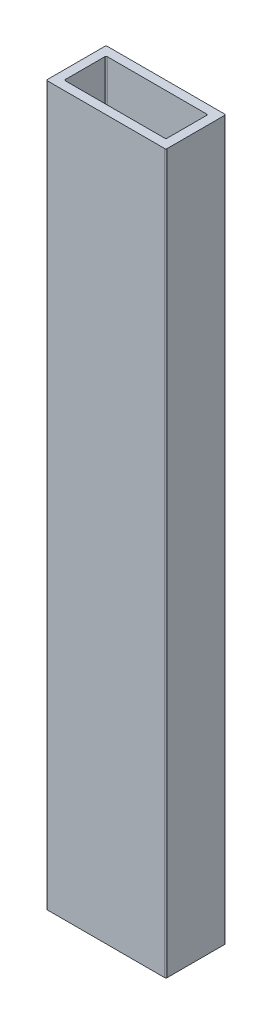
ISO-10303-21;
HEADER;
FILE_DESCRIPTION(('STEP AP214'),'2;1');
FILE_NAME('part.step','',(''),(''),'','','');
FILE_SCHEMA(('AUTOMOTIVE_DESIGN { 1 0 10303 214 1 1 1 1 }'));
ENDSEC;
DATA;
#1=APPLICATION_CONTEXT('core data for automotive mechanical design processes');
#2=APPLICATION_PROTOCOL_DEFINITION('international standard','automotive_design',2000,#1);
#3=PRODUCT_CONTEXT('',#1,'mechanical');
#4=PRODUCT('Part','Part','',(#3));
#5=PRODUCT_RELATED_PRODUCT_CATEGORY('part','',(#4));
#6=PRODUCT_DEFINITION_FORMATION('','',#4);
#7=PRODUCT_DEFINITION_CONTEXT('part definition',#1,'design');
#8=PRODUCT_DEFINITION('design','',#6,#7);
#9=PRODUCT_DEFINITION_SHAPE('','',#8);
#10=(LENGTH_UNIT() NAMED_UNIT(*) SI_UNIT(.MILLI.,.METRE.));
#11=(NAMED_UNIT(*) PLANE_ANGLE_UNIT() SI_UNIT($,.RADIAN.));
#12=(NAMED_UNIT(*) SI_UNIT($,.STERADIAN.) SOLID_ANGLE_UNIT());
#13=UNCERTAINTY_MEASURE_WITH_UNIT(LENGTH_MEASURE(1.E-05),#10,'distance_accuracy_value','');
#14=(GEOMETRIC_REPRESENTATION_CONTEXT(3) GLOBAL_UNCERTAINTY_ASSIGNED_CONTEXT((#13)) GLOBAL_UNIT_ASSIGNED_CONTEXT((#10,
#11,#12)) REPRESENTATION_CONTEXT('',''));
#15=CARTESIAN_POINT('',(0.,0.,0.));
#16=DIRECTION('',(0.,0.,1.));
#17=DIRECTION('',(1.,0.,0.));
#18=AXIS2_PLACEMENT_3D('',#15,#16,#17);
#19=CARTESIAN_POINT('',(0.,120.,0.));
#20=DIRECTION('',(0.,-1.,0.));
#21=DIRECTION('',(0.,0.,-1.));
#22=AXIS2_PLACEMENT_3D('',#19,#20,#21);
#23=PLANE('',#22);
#24=DIRECTION('',(0.,0.,-1.));
#25=VECTOR('',#24,1.);
#26=CARTESIAN_POINT('',(10.,120.,-5.));
#27=LINE('',#26,#25);
#28=CARTESIAN_POINT('',(10.,120.,4.8));
#29=VERTEX_POINT('',#28);
#30=CARTESIAN_POINT('',(10.,120.,-4.8));
#31=VERTEX_POINT('',#30);
#32=EDGE_CURVE('E278',#29,#31,#27,.T.);
#33=ORIENTED_EDGE('',*,*,#32,.T.);
#34=CARTESIAN_POINT('',(9.8,120.,-4.8));
#35=DIRECTION('',(0.,-1.,0.));
#36=DIRECTION('',(0.,0.,-1.));
#37=AXIS2_PLACEMENT_3D('',#34,#35,#36);
#38=CIRCLE('',#37,0.2);
#39=CARTESIAN_POINT('',(9.8,120.,-5.));
#40=VERTEX_POINT('',#39);
#41=EDGE_CURVE('E199',#31,#40,#38,.F.);
#42=ORIENTED_EDGE('',*,*,#41,.T.);
#43=DIRECTION('',(-1.,0.,0.));
#44=VECTOR('',#43,1.);
#45=CARTESIAN_POINT('',(10.,120.,-5.));
#46=LINE('',#45,#44);
#47=CARTESIAN_POINT('',(-9.8,120.,-5.));
#48=VERTEX_POINT('',#47);
#49=EDGE_CURVE('E168',#40,#48,#46,.T.);
#50=ORIENTED_EDGE('',*,*,#49,.T.);
#51=CARTESIAN_POINT('',(-9.8,120.,-4.8));
#52=DIRECTION('',(0.,-1.,0.));
#53=DIRECTION('',(0.,0.,-1.));
#54=AXIS2_PLACEMENT_3D('',#51,#52,#53);
#55=CIRCLE('',#54,0.2);
#56=CARTESIAN_POINT('',(-10.,120.,-4.8));
#57=VERTEX_POINT('',#56);
#58=EDGE_CURVE('E197',#48,#57,#55,.F.);
#59=ORIENTED_EDGE('',*,*,#58,.T.);
#60=DIRECTION('',(0.,0.,1.));
#61=VECTOR('',#60,1.);
#62=CARTESIAN_POINT('',(-10.,120.,-5.));
#63=LINE('',#62,#61);
#64=CARTESIAN_POINT('',(-10.,120.,4.8));
#65=VERTEX_POINT('',#64);
#66=EDGE_CURVE('E175',#57,#65,#63,.T.);
#67=ORIENTED_EDGE('',*,*,#66,.T.);
#68=CARTESIAN_POINT('',(-9.8,120.,4.8));
#69=DIRECTION('',(0.,-1.,0.));
#70=DIRECTION('',(0.,0.,-1.));
#71=AXIS2_PLACEMENT_3D('',#68,#69,#70);
#72=CIRCLE('',#71,0.2);
#73=CARTESIAN_POINT('',(-9.8,120.,5.));
#74=VERTEX_POINT('',#73);
#75=EDGE_CURVE('E193',#65,#74,#72,.F.);
#76=ORIENTED_EDGE('',*,*,#75,.T.);
#77=DIRECTION('',(1.,0.,0.));
#78=VECTOR('',#77,1.);
#79=CARTESIAN_POINT('',(10.,120.,5.));
#80=LINE('',#79,#78);
#81=CARTESIAN_POINT('',(9.8,120.,5.));
#82=VERTEX_POINT('',#81);
#83=EDGE_CURVE('E179',#74,#82,#80,.T.);
#84=ORIENTED_EDGE('',*,*,#83,.T.);
#85=CARTESIAN_POINT('',(9.8,120.,4.8));
#86=DIRECTION('',(0.,-1.,0.));
#87=DIRECTION('',(0.,0.,-1.));
#88=AXIS2_PLACEMENT_3D('',#85,#86,#87);
#89=CIRCLE('',#88,0.2);
#90=EDGE_CURVE('E195',#82,#29,#89,.F.);
#91=ORIENTED_EDGE('',*,*,#90,.T.);
#92=EDGE_LOOP('',(#33,#42,#50,#59,#67,#76,#84,#91));
#93=FACE_BOUND('',#92,.T.);
#94=DIRECTION('',(0.,0.,-1.));
#95=VECTOR('',#94,1.);
#96=CARTESIAN_POINT('',(8.5,120.,-3.5));
#97=LINE('',#96,#95);
#98=CARTESIAN_POINT('',(8.5,120.,3.3));
#99=VERTEX_POINT('',#98);
#100=CARTESIAN_POINT('',(8.5,120.,-3.3));
#101=VERTEX_POINT('',#100);
#102=EDGE_CURVE('E260',#99,#101,#97,.T.);
#103=ORIENTED_EDGE('',*,*,#102,.F.);
#104=CARTESIAN_POINT('',(8.3,120.,3.3));
#105=DIRECTION('',(0.,-1.,0.));
#106=DIRECTION('',(0.,0.,-1.));
#107=AXIS2_PLACEMENT_3D('',#104,#105,#106);
#108=CIRCLE('',#107,0.2);
#109=CARTESIAN_POINT('',(8.3,120.,3.5));
#110=VERTEX_POINT('',#109);
#111=EDGE_CURVE('E236',#99,#110,#108,.T.);
#112=ORIENTED_EDGE('',*,*,#111,.T.);
#113=DIRECTION('',(1.,0.,0.));
#114=VECTOR('',#113,1.);
#115=CARTESIAN_POINT('',(8.5,120.,3.5));
#116=LINE('',#115,#114);
#117=CARTESIAN_POINT('',(-8.3,120.,3.5));
#118=VERTEX_POINT('',#117);
#119=EDGE_CURVE('E262',#118,#110,#116,.T.);
#120=ORIENTED_EDGE('',*,*,#119,.F.);
#121=CARTESIAN_POINT('',(-8.3,120.,3.3));
#122=DIRECTION('',(0.,-1.,0.));
#123=DIRECTION('',(0.,0.,-1.));
#124=AXIS2_PLACEMENT_3D('',#121,#122,#123);
#125=CIRCLE('',#124,0.2);
#126=CARTESIAN_POINT('',(-8.5,120.,3.3));
#127=VERTEX_POINT('',#126);
#128=EDGE_CURVE('E240',#118,#127,#125,.T.);
#129=ORIENTED_EDGE('',*,*,#128,.T.);
#130=DIRECTION('',(0.,0.,1.));
#131=VECTOR('',#130,1.);
#132=CARTESIAN_POINT('',(-8.5,120.,-3.5));
#133=LINE('',#132,#131);
#134=CARTESIAN_POINT('',(-8.5,120.,-3.3));
#135=VERTEX_POINT('',#134);
#136=EDGE_CURVE('E259',#135,#127,#133,.T.);
#137=ORIENTED_EDGE('',*,*,#136,.F.);
#138=CARTESIAN_POINT('',(-8.3,120.,-3.3));
#139=DIRECTION('',(0.,-1.,0.));
#140=DIRECTION('',(0.,0.,-1.));
#141=AXIS2_PLACEMENT_3D('',#138,#139,#140);
#142=CIRCLE('',#141,0.2);
#143=CARTESIAN_POINT('',(-8.3,120.,-3.5));
#144=VERTEX_POINT('',#143);
#145=EDGE_CURVE('E11',#135,#144,#142,.T.);
#146=ORIENTED_EDGE('',*,*,#145,.T.);
#147=DIRECTION('',(-1.,0.,0.));
#148=VECTOR('',#147,1.);
#149=CARTESIAN_POINT('',(8.5,120.,-3.5));
#150=LINE('',#149,#148);
#151=CARTESIAN_POINT('',(8.3,120.,-3.5));
#152=VERTEX_POINT('',#151);
#153=EDGE_CURVE('E257',#152,#144,#150,.T.);
#154=ORIENTED_EDGE('',*,*,#153,.F.);
#155=CARTESIAN_POINT('',(8.3,120.,-3.3));
#156=DIRECTION('',(0.,-1.,0.));
#157=DIRECTION('',(0.,0.,-1.));
#158=AXIS2_PLACEMENT_3D('',#155,#156,#157);
#159=CIRCLE('',#158,0.2);
#160=EDGE_CURVE('E232',#152,#101,#159,.T.);
#161=ORIENTED_EDGE('',*,*,#160,.T.);
#162=EDGE_LOOP('',(#103,#112,#120,#129,#137,#146,#154,#161));
#163=FACE_BOUND('',#162,.T.);
#164=ADVANCED_FACE('F35',(#93,#163),#23,.F.);
#165=CARTESIAN_POINT('',(0.,0.,0.));
#166=DIRECTION('',(0.,-1.,0.));
#167=DIRECTION('',(0.,0.,-1.));
#168=AXIS2_PLACEMENT_3D('',#165,#166,#167);
#169=PLANE('',#168);
#170=DIRECTION('',(-1.,0.,0.));
#171=VECTOR('',#170,1.);
#172=CARTESIAN_POINT('',(10.,0.,-5.));
#173=LINE('',#172,#171);
#174=CARTESIAN_POINT('',(9.8,0.,-5.));
#175=VERTEX_POINT('',#174);
#176=CARTESIAN_POINT('',(-9.8,0.,-5.));
#177=VERTEX_POINT('',#176);
#178=EDGE_CURVE('E165',#175,#177,#173,.T.);
#179=ORIENTED_EDGE('',*,*,#178,.F.);
#180=CARTESIAN_POINT('',(9.8,0.,-4.8));
#181=DIRECTION('',(0.,-1.,0.));
#182=DIRECTION('',(0.,0.,-1.));
#183=AXIS2_PLACEMENT_3D('',#180,#181,#182);
#184=CIRCLE('',#183,0.2);
#185=CARTESIAN_POINT('',(10.,0.,-4.8));
#186=VERTEX_POINT('',#185);
#187=EDGE_CURVE('E148',#175,#186,#184,.T.);
#188=ORIENTED_EDGE('',*,*,#187,.T.);
#189=DIRECTION('',(0.,0.,-1.));
#190=VECTOR('',#189,1.);
#191=CARTESIAN_POINT('',(10.,0.,-5.));
#192=LINE('',#191,#190);
#193=CARTESIAN_POINT('',(10.,0.,4.8));
#194=VERTEX_POINT('',#193);
#195=EDGE_CURVE('E176',#194,#186,#192,.T.);
#196=ORIENTED_EDGE('',*,*,#195,.F.);
#197=CARTESIAN_POINT('',(9.8,0.,4.8));
#198=DIRECTION('',(0.,-1.,0.));
#199=DIRECTION('',(0.,0.,-1.));
#200=AXIS2_PLACEMENT_3D('',#197,#198,#199);
#201=CIRCLE('',#200,0.2);
#202=CARTESIAN_POINT('',(9.8,0.,5.));
#203=VERTEX_POINT('',#202);
#204=EDGE_CURVE('E187',#194,#203,#201,.T.);
#205=ORIENTED_EDGE('',*,*,#204,.T.);
#206=DIRECTION('',(1.,0.,0.));
#207=VECTOR('',#206,1.);
#208=CARTESIAN_POINT('',(10.,0.,5.));
#209=LINE('',#208,#207);
#210=CARTESIAN_POINT('',(-9.8,0.,5.));
#211=VERTEX_POINT('',#210);
#212=EDGE_CURVE('E181',#211,#203,#209,.T.);
#213=ORIENTED_EDGE('',*,*,#212,.F.);
#214=CARTESIAN_POINT('',(-9.8,0.,4.8));
#215=DIRECTION('',(0.,-1.,0.));
#216=DIRECTION('',(0.,0.,-1.));
#217=AXIS2_PLACEMENT_3D('',#214,#215,#216);
#218=CIRCLE('',#217,0.2);
#219=CARTESIAN_POINT('',(-10.,0.,4.8));
#220=VERTEX_POINT('',#219);
#221=EDGE_CURVE('E169',#211,#220,#218,.T.);
#222=ORIENTED_EDGE('',*,*,#221,.T.);
#223=DIRECTION('',(0.,0.,1.));
#224=VECTOR('',#223,1.);
#225=CARTESIAN_POINT('',(-10.,0.,-5.));
#226=LINE('',#225,#224);
#227=CARTESIAN_POINT('',(-10.,0.,-4.8));
#228=VERTEX_POINT('',#227);
#229=EDGE_CURVE('E269',#228,#220,#226,.T.);
#230=ORIENTED_EDGE('',*,*,#229,.F.);
#231=CARTESIAN_POINT('',(-9.8,0.,-4.8));
#232=DIRECTION('',(0.,-1.,0.));
#233=DIRECTION('',(0.,0.,-1.));
#234=AXIS2_PLACEMENT_3D('',#231,#232,#233);
#235=CIRCLE('',#234,0.2);
#236=EDGE_CURVE('E159',#228,#177,#235,.T.);
#237=ORIENTED_EDGE('',*,*,#236,.T.);
#238=EDGE_LOOP('',(#179,#188,#196,#205,#213,#222,#230,#237));
#239=FACE_BOUND('',#238,.T.);
#240=DIRECTION('',(0.,0.,1.));
#241=VECTOR('',#240,1.);
#242=CARTESIAN_POINT('',(-8.5,0.,-3.5));
#243=LINE('',#242,#241);
#244=CARTESIAN_POINT('',(-8.5,0.,-3.3));
#245=VERTEX_POINT('',#244);
#246=CARTESIAN_POINT('',(-8.5,0.,3.3));
#247=VERTEX_POINT('',#246);
#248=EDGE_CURVE('E244',#245,#247,#243,.T.);
#249=ORIENTED_EDGE('',*,*,#248,.T.);
#250=CARTESIAN_POINT('',(-8.3,0.,3.3));
#251=DIRECTION('',(0.,-1.,0.));
#252=DIRECTION('',(0.,0.,-1.));
#253=AXIS2_PLACEMENT_3D('',#250,#251,#252);
#254=CIRCLE('',#253,0.2);
#255=CARTESIAN_POINT('',(-8.3,0.,3.5));
#256=VERTEX_POINT('',#255);
#257=EDGE_CURVE('E238',#247,#256,#254,.F.);
#258=ORIENTED_EDGE('',*,*,#257,.T.);
#259=DIRECTION('',(1.,0.,0.));
#260=VECTOR('',#259,1.);
#261=CARTESIAN_POINT('',(8.5,0.,3.5));
#262=LINE('',#261,#260);
#263=CARTESIAN_POINT('',(8.3,0.,3.5));
#264=VERTEX_POINT('',#263);
#265=EDGE_CURVE('E253',#256,#264,#262,.T.);
#266=ORIENTED_EDGE('',*,*,#265,.T.);
#267=CARTESIAN_POINT('',(8.3,0.,3.3));
#268=DIRECTION('',(0.,-1.,0.));
#269=DIRECTION('',(0.,0.,-1.));
#270=AXIS2_PLACEMENT_3D('',#267,#268,#269);
#271=CIRCLE('',#270,0.2);
#272=CARTESIAN_POINT('',(8.5,0.,3.3));
#273=VERTEX_POINT('',#272);
#274=EDGE_CURVE('E234',#264,#273,#271,.F.);
#275=ORIENTED_EDGE('',*,*,#274,.T.);
#276=DIRECTION('',(0.,0.,-1.));
#277=VECTOR('',#276,1.);
#278=CARTESIAN_POINT('',(8.5,0.,-3.5));
#279=LINE('',#278,#277);
#280=CARTESIAN_POINT('',(8.5,0.,-3.3));
#281=VERTEX_POINT('',#280);
#282=EDGE_CURVE('E270',#273,#281,#279,.T.);
#283=ORIENTED_EDGE('',*,*,#282,.T.);
#284=CARTESIAN_POINT('',(8.3,0.,-3.3));
#285=DIRECTION('',(0.,-1.,0.));
#286=DIRECTION('',(0.,0.,-1.));
#287=AXIS2_PLACEMENT_3D('',#284,#285,#286);
#288=CIRCLE('',#287,0.2);
#289=CARTESIAN_POINT('',(8.3,0.,-3.5));
#290=VERTEX_POINT('',#289);
#291=EDGE_CURVE('E230',#281,#290,#288,.F.);
#292=ORIENTED_EDGE('',*,*,#291,.T.);
#293=DIRECTION('',(-1.,0.,0.));
#294=VECTOR('',#293,1.);
#295=CARTESIAN_POINT('',(8.5,0.,-3.5));
#296=LINE('',#295,#294);
#297=CARTESIAN_POINT('',(-8.3,0.,-3.5));
#298=VERTEX_POINT('',#297);
#299=EDGE_CURVE('E245',#290,#298,#296,.T.);
#300=ORIENTED_EDGE('',*,*,#299,.T.);
#301=CARTESIAN_POINT('',(-8.3,0.,-3.3));
#302=DIRECTION('',(0.,-1.,0.));
#303=DIRECTION('',(0.,0.,-1.));
#304=AXIS2_PLACEMENT_3D('',#301,#302,#303);
#305=CIRCLE('',#304,0.2);
#306=EDGE_CURVE('E43',#298,#245,#305,.F.);
#307=ORIENTED_EDGE('',*,*,#306,.T.);
#308=EDGE_LOOP('',(#249,#258,#266,#275,#283,#292,#300,#307));
#309=FACE_BOUND('',#308,.T.);
#310=ADVANCED_FACE('F172',(#239,#309),#169,.T.);
#311=CARTESIAN_POINT('',(-10.,120.,-5.));
#312=DIRECTION('',(1.,0.,0.));
#313=DIRECTION('',(0.,0.,-1.));
#314=AXIS2_PLACEMENT_3D('',#311,#312,#313);
#315=PLANE('',#314);
#316=ORIENTED_EDGE('',*,*,#66,.F.);
#317=DIRECTION('',(0.,-1.,0.));
#318=VECTOR('',#317,1.);
#319=CARTESIAN_POINT('',(-10.,120.,-4.8));
#320=LINE('',#319,#318);
#321=EDGE_CURVE('E222',#57,#228,#320,.T.);
#322=ORIENTED_EDGE('',*,*,#321,.T.);
#323=ORIENTED_EDGE('',*,*,#229,.T.);
#324=DIRECTION('',(0.,-1.,0.));
#325=VECTOR('',#324,1.);
#326=CARTESIAN_POINT('',(-10.,120.,4.8));
#327=LINE('',#326,#325);
#328=EDGE_CURVE('E220',#220,#65,#327,.F.);
#329=ORIENTED_EDGE('',*,*,#328,.T.);
#330=EDGE_LOOP('',(#316,#322,#323,#329));
#331=FACE_BOUND('',#330,.T.);
#332=ADVANCED_FACE('F306',(#331),#315,.F.);
#333=CARTESIAN_POINT('',(10.,120.,5.));
#334=DIRECTION('',(0.,0.,-1.));
#335=DIRECTION('',(-1.,0.,0.));
#336=AXIS2_PLACEMENT_3D('',#333,#334,#335);
#337=PLANE('',#336);
#338=ORIENTED_EDGE('',*,*,#212,.T.);
#339=DIRECTION('',(0.,-1.,0.));
#340=VECTOR('',#339,1.);
#341=CARTESIAN_POINT('',(9.8,120.,5.));
#342=LINE('',#341,#340);
#343=EDGE_CURVE('E228',#203,#82,#342,.F.);
#344=ORIENTED_EDGE('',*,*,#343,.T.);
#345=ORIENTED_EDGE('',*,*,#83,.F.);
#346=DIRECTION('',(0.,-1.,0.));
#347=VECTOR('',#346,1.);
#348=CARTESIAN_POINT('',(-9.8,120.,5.));
#349=LINE('',#348,#347);
#350=EDGE_CURVE('E225',#74,#211,#349,.T.);
#351=ORIENTED_EDGE('',*,*,#350,.T.);
#352=EDGE_LOOP('',(#338,#344,#345,#351));
#353=FACE_BOUND('',#352,.T.);
#354=ADVANCED_FACE('F287',(#353),#337,.F.);
#355=CARTESIAN_POINT('',(10.,120.,-5.));
#356=DIRECTION('',(-1.,0.,0.));
#357=DIRECTION('',(0.,0.,1.));
#358=AXIS2_PLACEMENT_3D('',#355,#356,#357);
#359=PLANE('',#358);
#360=ORIENTED_EDGE('',*,*,#195,.T.);
#361=DIRECTION('',(0.,-1.,0.));
#362=VECTOR('',#361,1.);
#363=CARTESIAN_POINT('',(10.,120.,-4.8));
#364=LINE('',#363,#362);
#365=EDGE_CURVE('E153',#186,#31,#364,.F.);
#366=ORIENTED_EDGE('',*,*,#365,.T.);
#367=ORIENTED_EDGE('',*,*,#32,.F.);
#368=DIRECTION('',(0.,-1.,0.));
#369=VECTOR('',#368,1.);
#370=CARTESIAN_POINT('',(10.,120.,4.8));
#371=LINE('',#370,#369);
#372=EDGE_CURVE('E158',#29,#194,#371,.T.);
#373=ORIENTED_EDGE('',*,*,#372,.T.);
#374=EDGE_LOOP('',(#360,#366,#367,#373));
#375=FACE_BOUND('',#374,.T.);
#376=ADVANCED_FACE('F297',(#375),#359,.F.);
#377=CARTESIAN_POINT('',(10.,120.,-5.));
#378=DIRECTION('',(0.,0.,1.));
#379=DIRECTION('',(1.,0.,0.));
#380=AXIS2_PLACEMENT_3D('',#377,#378,#379);
#381=PLANE('',#380);
#382=ORIENTED_EDGE('',*,*,#49,.F.);
#383=DIRECTION('',(0.,-1.,0.));
#384=VECTOR('',#383,1.);
#385=CARTESIAN_POINT('',(9.8,120.,-5.));
#386=LINE('',#385,#384);
#387=EDGE_CURVE('E152',#40,#175,#386,.T.);
#388=ORIENTED_EDGE('',*,*,#387,.T.);
#389=ORIENTED_EDGE('',*,*,#178,.T.);
#390=DIRECTION('',(0.,-1.,0.));
#391=VECTOR('',#390,1.);
#392=CARTESIAN_POINT('',(-9.8,120.,-5.));
#393=LINE('',#392,#391);
#394=EDGE_CURVE('E170',#177,#48,#393,.F.);
#395=ORIENTED_EDGE('',*,*,#394,.T.);
#396=EDGE_LOOP('',(#382,#388,#389,#395));
#397=FACE_BOUND('',#396,.T.);
#398=ADVANCED_FACE('F164',(#397),#381,.F.);
#399=CARTESIAN_POINT('',(8.5,120.,-3.5));
#400=DIRECTION('',(-1.,0.,0.));
#401=DIRECTION('',(0.,0.,1.));
#402=AXIS2_PLACEMENT_3D('',#399,#400,#401);
#403=PLANE('',#402);
#404=ORIENTED_EDGE('',*,*,#102,.T.);
#405=DIRECTION('',(0.,-1.,0.));
#406=VECTOR('',#405,1.);
#407=CARTESIAN_POINT('',(8.5,0.,-3.3));
#408=LINE('',#407,#406);
#409=EDGE_CURVE('E203',#101,#281,#408,.T.);
#410=ORIENTED_EDGE('',*,*,#409,.T.);
#411=ORIENTED_EDGE('',*,*,#282,.F.);
#412=DIRECTION('',(0.,-1.,0.));
#413=VECTOR('',#412,1.);
#414=CARTESIAN_POINT('',(8.5,120.,3.3));
#415=LINE('',#414,#413);
#416=EDGE_CURVE('E201',#273,#99,#415,.F.);
#417=ORIENTED_EDGE('',*,*,#416,.T.);
#418=EDGE_LOOP('',(#404,#410,#411,#417));
#419=FACE_BOUND('',#418,.T.);
#420=ADVANCED_FACE('F304',(#419),#403,.T.);
#421=CARTESIAN_POINT('',(8.5,120.,-3.5));
#422=DIRECTION('',(0.,0.,1.));
#423=DIRECTION('',(1.,0.,0.));
#424=AXIS2_PLACEMENT_3D('',#421,#422,#423);
#425=PLANE('',#424);
#426=ORIENTED_EDGE('',*,*,#299,.F.);
#427=DIRECTION('',(0.,-1.,0.));
#428=VECTOR('',#427,1.);
#429=CARTESIAN_POINT('',(8.3,120.,-3.5));
#430=LINE('',#429,#428);
#431=EDGE_CURVE('E55',#290,#152,#430,.F.);
#432=ORIENTED_EDGE('',*,*,#431,.T.);
#433=ORIENTED_EDGE('',*,*,#153,.T.);
#434=DIRECTION('',(0.,-1.,0.));
#435=VECTOR('',#434,1.);
#436=CARTESIAN_POINT('',(-8.3,0.,-3.5));
#437=LINE('',#436,#435);
#438=EDGE_CURVE('E206',#144,#298,#437,.T.);
#439=ORIENTED_EDGE('',*,*,#438,.T.);
#440=EDGE_LOOP('',(#426,#432,#433,#439));
#441=FACE_BOUND('',#440,.T.);
#442=ADVANCED_FACE('F256',(#441),#425,.T.);
#443=CARTESIAN_POINT('',(-8.5,120.,-3.5));
#444=DIRECTION('',(1.,0.,0.));
#445=DIRECTION('',(0.,0.,-1.));
#446=AXIS2_PLACEMENT_3D('',#443,#444,#445);
#447=PLANE('',#446);
#448=ORIENTED_EDGE('',*,*,#136,.T.);
#449=DIRECTION('',(0.,-1.,0.));
#450=VECTOR('',#449,1.);
#451=CARTESIAN_POINT('',(-8.5,0.,3.3));
#452=LINE('',#451,#450);
#453=EDGE_CURVE('E217',#127,#247,#452,.T.);
#454=ORIENTED_EDGE('',*,*,#453,.T.);
#455=ORIENTED_EDGE('',*,*,#248,.F.);
#456=DIRECTION('',(0.,-1.,0.));
#457=VECTOR('',#456,1.);
#458=CARTESIAN_POINT('',(-8.5,120.,-3.3));
#459=LINE('',#458,#457);
#460=EDGE_CURVE('E215',#245,#135,#459,.F.);
#461=ORIENTED_EDGE('',*,*,#460,.T.);
#462=EDGE_LOOP('',(#448,#454,#455,#461));
#463=FACE_BOUND('',#462,.T.);
#464=ADVANCED_FACE('F251',(#463),#447,.T.);
#465=CARTESIAN_POINT('',(8.5,120.,3.5));
#466=DIRECTION('',(0.,0.,-1.));
#467=DIRECTION('',(-1.,0.,0.));
#468=AXIS2_PLACEMENT_3D('',#465,#466,#467);
#469=PLANE('',#468);
#470=ORIENTED_EDGE('',*,*,#119,.T.);
#471=DIRECTION('',(0.,-1.,0.));
#472=VECTOR('',#471,1.);
#473=CARTESIAN_POINT('',(8.3,0.,3.5));
#474=LINE('',#473,#472);
#475=EDGE_CURVE('E212',#110,#264,#474,.T.);
#476=ORIENTED_EDGE('',*,*,#475,.T.);
#477=ORIENTED_EDGE('',*,*,#265,.F.);
#478=DIRECTION('',(0.,-1.,0.));
#479=VECTOR('',#478,1.);
#480=CARTESIAN_POINT('',(-8.3,120.,3.5));
#481=LINE('',#480,#479);
#482=EDGE_CURVE('E210',#256,#118,#481,.F.);
#483=ORIENTED_EDGE('',*,*,#482,.T.);
#484=EDGE_LOOP('',(#470,#476,#477,#483));
#485=FACE_BOUND('',#484,.T.);
#486=ADVANCED_FACE('F322',(#485),#469,.T.);
#487=CARTESIAN_POINT('',(9.8,120.,-4.8));
#488=DIRECTION('',(0.,-1.,0.));
#489=DIRECTION('',(0.,0.,-1.));
#490=AXIS2_PLACEMENT_3D('',#487,#488,#489);
#491=CYLINDRICAL_SURFACE('',#490,0.2);
#492=ORIENTED_EDGE('',*,*,#41,.F.);
#493=ORIENTED_EDGE('',*,*,#365,.F.);
#494=ORIENTED_EDGE('',*,*,#187,.F.);
#495=ORIENTED_EDGE('',*,*,#387,.F.);
#496=EDGE_LOOP('',(#492,#493,#494,#495));
#497=FACE_BOUND('',#496,.T.);
#498=ADVANCED_FACE('F151',(#497),#491,.T.);
#499=CARTESIAN_POINT('',(8.3,120.,-3.3));
#500=DIRECTION('',(0.,1.,0.));
#501=DIRECTION('',(0.,0.,1.));
#502=AXIS2_PLACEMENT_3D('',#499,#500,#501);
#503=CYLINDRICAL_SURFACE('',#502,0.2);
#504=ORIENTED_EDGE('',*,*,#160,.F.);
#505=ORIENTED_EDGE('',*,*,#431,.F.);
#506=ORIENTED_EDGE('',*,*,#291,.F.);
#507=ORIENTED_EDGE('',*,*,#409,.F.);
#508=EDGE_LOOP('',(#504,#505,#506,#507));
#509=FACE_BOUND('',#508,.T.);
#510=ADVANCED_FACE('F328',(#509),#503,.F.);
#511=CARTESIAN_POINT('',(8.3,120.,3.3));
#512=DIRECTION('',(0.,1.,0.));
#513=DIRECTION('',(0.,0.,1.));
#514=AXIS2_PLACEMENT_3D('',#511,#512,#513);
#515=CYLINDRICAL_SURFACE('',#514,0.2);
#516=ORIENTED_EDGE('',*,*,#111,.F.);
#517=ORIENTED_EDGE('',*,*,#416,.F.);
#518=ORIENTED_EDGE('',*,*,#274,.F.);
#519=ORIENTED_EDGE('',*,*,#475,.F.);
#520=EDGE_LOOP('',(#516,#517,#518,#519));
#521=FACE_BOUND('',#520,.T.);
#522=ADVANCED_FACE('F337',(#521),#515,.F.);
#523=CARTESIAN_POINT('',(-8.3,120.,3.3));
#524=DIRECTION('',(0.,1.,0.));
#525=DIRECTION('',(0.,0.,1.));
#526=AXIS2_PLACEMENT_3D('',#523,#524,#525);
#527=CYLINDRICAL_SURFACE('',#526,0.2);
#528=ORIENTED_EDGE('',*,*,#128,.F.);
#529=ORIENTED_EDGE('',*,*,#482,.F.);
#530=ORIENTED_EDGE('',*,*,#257,.F.);
#531=ORIENTED_EDGE('',*,*,#453,.F.);
#532=EDGE_LOOP('',(#528,#529,#530,#531));
#533=FACE_BOUND('',#532,.T.);
#534=ADVANCED_FACE('F348',(#533),#527,.F.);
#535=CARTESIAN_POINT('',(-8.3,120.,-3.3));
#536=DIRECTION('',(0.,1.,0.));
#537=DIRECTION('',(0.,0.,1.));
#538=AXIS2_PLACEMENT_3D('',#535,#536,#537);
#539=CYLINDRICAL_SURFACE('',#538,0.2);
#540=ORIENTED_EDGE('',*,*,#145,.F.);
#541=ORIENTED_EDGE('',*,*,#460,.F.);
#542=ORIENTED_EDGE('',*,*,#306,.F.);
#543=ORIENTED_EDGE('',*,*,#438,.F.);
#544=EDGE_LOOP('',(#540,#541,#542,#543));
#545=FACE_BOUND('',#544,.T.);
#546=ADVANCED_FACE('F255',(#545),#539,.F.);
#547=CARTESIAN_POINT('',(-9.8,120.,-4.8));
#548=DIRECTION('',(0.,-1.,0.));
#549=DIRECTION('',(0.,0.,-1.));
#550=AXIS2_PLACEMENT_3D('',#547,#548,#549);
#551=CYLINDRICAL_SURFACE('',#550,0.2);
#552=ORIENTED_EDGE('',*,*,#58,.F.);
#553=ORIENTED_EDGE('',*,*,#394,.F.);
#554=ORIENTED_EDGE('',*,*,#236,.F.);
#555=ORIENTED_EDGE('',*,*,#321,.F.);
#556=EDGE_LOOP('',(#552,#553,#554,#555));
#557=FACE_BOUND('',#556,.T.);
#558=ADVANCED_FACE('F357',(#557),#551,.T.);
#559=CARTESIAN_POINT('',(9.8,120.,4.8));
#560=DIRECTION('',(0.,-1.,0.));
#561=DIRECTION('',(0.,0.,-1.));
#562=AXIS2_PLACEMENT_3D('',#559,#560,#561);
#563=CYLINDRICAL_SURFACE('',#562,0.2);
#564=ORIENTED_EDGE('',*,*,#90,.F.);
#565=ORIENTED_EDGE('',*,*,#343,.F.);
#566=ORIENTED_EDGE('',*,*,#204,.F.);
#567=ORIENTED_EDGE('',*,*,#372,.F.);
#568=EDGE_LOOP('',(#564,#565,#566,#567));
#569=FACE_BOUND('',#568,.T.);
#570=ADVANCED_FACE('F292',(#569),#563,.T.);
#571=CARTESIAN_POINT('',(-9.8,120.,4.8));
#572=DIRECTION('',(0.,-1.,0.));
#573=DIRECTION('',(0.,0.,-1.));
#574=AXIS2_PLACEMENT_3D('',#571,#572,#573);
#575=CYLINDRICAL_SURFACE('',#574,0.2);
#576=ORIENTED_EDGE('',*,*,#75,.F.);
#577=ORIENTED_EDGE('',*,*,#328,.F.);
#578=ORIENTED_EDGE('',*,*,#221,.F.);
#579=ORIENTED_EDGE('',*,*,#350,.F.);
#580=EDGE_LOOP('',(#576,#577,#578,#579));
#581=FACE_BOUND('',#580,.T.);
#582=ADVANCED_FACE('F37',(#581),#575,.T.);
#583=CLOSED_SHELL('',(#164,#310,#332,#354,#376,#398,#420,#442,#464,#486,#498,#510,#522,#534,
#546,#558,#570,#582));
#584=MANIFOLD_SOLID_BREP('B2',#583);
#585=ADVANCED_BREP_SHAPE_REPRESENTATION('',(#18,#584),#14);
#586=SHAPE_DEFINITION_REPRESENTATION(#9,#585);
ENDSEC;
END-ISO-10303-21;
